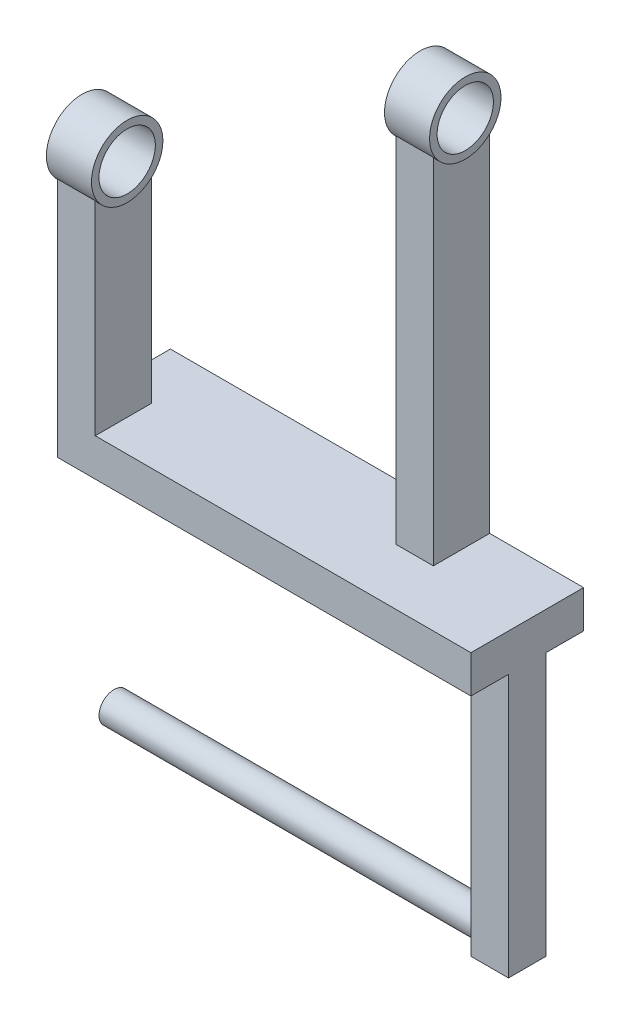
ISO-10303-21;
HEADER;
FILE_DESCRIPTION(('STEP AP214'),'2;1');
FILE_NAME('part.step','',(''),(''),'','','');
FILE_SCHEMA(('AUTOMOTIVE_DESIGN { 1 0 10303 214 1 1 1 1 }'));
ENDSEC;
DATA;
#1=APPLICATION_CONTEXT('core data for automotive mechanical design processes');
#2=APPLICATION_PROTOCOL_DEFINITION('international standard','automotive_design',2000,#1);
#3=PRODUCT_CONTEXT('',#1,'mechanical');
#4=PRODUCT('Part','Part','',(#3));
#5=PRODUCT_RELATED_PRODUCT_CATEGORY('part','',(#4));
#6=PRODUCT_DEFINITION_FORMATION('','',#4);
#7=PRODUCT_DEFINITION_CONTEXT('part definition',#1,'design');
#8=PRODUCT_DEFINITION('design','',#6,#7);
#9=PRODUCT_DEFINITION_SHAPE('','',#8);
#10=(LENGTH_UNIT() NAMED_UNIT(*) SI_UNIT(.MILLI.,.METRE.));
#11=(NAMED_UNIT(*) PLANE_ANGLE_UNIT() SI_UNIT($,.RADIAN.));
#12=(NAMED_UNIT(*) SI_UNIT($,.STERADIAN.) SOLID_ANGLE_UNIT());
#13=UNCERTAINTY_MEASURE_WITH_UNIT(LENGTH_MEASURE(1.E-05),#10,'distance_accuracy_value','');
#14=(GEOMETRIC_REPRESENTATION_CONTEXT(3) GLOBAL_UNCERTAINTY_ASSIGNED_CONTEXT((#13)) GLOBAL_UNIT_ASSIGNED_CONTEXT((#10,
#11,#12)) REPRESENTATION_CONTEXT('',''));
#15=CARTESIAN_POINT('',(0.,0.,0.));
#16=DIRECTION('',(0.,0.,1.));
#17=DIRECTION('',(1.,0.,0.));
#18=AXIS2_PLACEMENT_3D('',#15,#16,#17);
#19=CARTESIAN_POINT('',(-60.,10.,-15.));
#20=DIRECTION('',(0.,0.,1.));
#21=DIRECTION('',(1.,0.,0.));
#22=AXIS2_PLACEMENT_3D('',#19,#20,#21);
#23=PLANE('',#22);
#24=DIRECTION('',(1.,0.,0.));
#25=VECTOR('',#24,1.);
#26=CARTESIAN_POINT('',(14.,104.169048105155,-15.));
#27=LINE('',#26,#25);
#28=CARTESIAN_POINT('',(25.,104.169048105155,-15.));
#29=VERTEX_POINT('',#28);
#30=CARTESIAN_POINT('',(15.,104.169048105155,-15.));
#31=VERTEX_POINT('',#30);
#32=EDGE_CURVE('E218',#29,#31,#27,.F.);
#33=ORIENTED_EDGE('',*,*,#32,.F.);
#34=DIRECTION('',(0.,-1.,0.));
#35=VECTOR('',#34,1.);
#36=CARTESIAN_POINT('',(25.,110.,-15.));
#37=LINE('',#36,#35);
#38=CARTESIAN_POINT('',(25.,10.,-15.));
#39=VERTEX_POINT('',#38);
#40=EDGE_CURVE('E237',#29,#39,#37,.T.);
#41=ORIENTED_EDGE('',*,*,#40,.T.);
#42=DIRECTION('',(-1.,0.,0.));
#43=VECTOR('',#42,1.);
#44=CARTESIAN_POINT('',(-60.,10.,-15.));
#45=LINE('',#44,#43);
#46=CARTESIAN_POINT('',(50.,10.,-15.));
#47=VERTEX_POINT('',#46);
#48=EDGE_CURVE('E304',#47,#39,#45,.T.);
#49=ORIENTED_EDGE('',*,*,#48,.F.);
#50=DIRECTION('',(0.,-1.,0.));
#51=VECTOR('',#50,1.);
#52=CARTESIAN_POINT('',(50.,10.,-15.));
#53=LINE('',#52,#51);
#54=CARTESIAN_POINT('',(50.,0.,-15.));
#55=VERTEX_POINT('',#54);
#56=EDGE_CURVE('E322',#47,#55,#53,.T.);
#57=ORIENTED_EDGE('',*,*,#56,.T.);
#58=DIRECTION('',(-1.,0.,0.));
#59=VECTOR('',#58,1.);
#60=CARTESIAN_POINT('',(-60.,0.,-15.));
#61=LINE('',#60,#59);
#62=CARTESIAN_POINT('',(-60.,0.,-15.));
#63=VERTEX_POINT('',#62);
#64=EDGE_CURVE('E297',#55,#63,#61,.T.);
#65=ORIENTED_EDGE('',*,*,#64,.T.);
#66=DIRECTION('',(0.,-1.,0.));
#67=VECTOR('',#66,1.);
#68=CARTESIAN_POINT('',(-60.,10.,-15.));
#69=LINE('',#68,#67);
#70=CARTESIAN_POINT('',(-60.,10.,-15.));
#71=VERTEX_POINT('',#70);
#72=EDGE_CURVE('E308',#71,#63,#69,.T.);
#73=ORIENTED_EDGE('',*,*,#72,.F.);
#74=CARTESIAN_POINT('',(15.,10.,-15.));
#75=VERTEX_POINT('',#74);
#76=EDGE_CURVE('E303',#75,#71,#45,.T.);
#77=ORIENTED_EDGE('',*,*,#76,.F.);
#78=DIRECTION('',(0.,-1.,0.));
#79=VECTOR('',#78,1.);
#80=CARTESIAN_POINT('',(15.,110.,-15.));
#81=LINE('',#80,#79);
#82=EDGE_CURVE('E234',#31,#75,#81,.T.);
#83=ORIENTED_EDGE('',*,*,#82,.F.);
#84=EDGE_LOOP('',(#33,#41,#49,#57,#65,#73,#77,#83));
#85=FACE_BOUND('',#84,.T.);
#86=ADVANCED_FACE('F53',(#85),#23,.F.);
#87=CARTESIAN_POINT('',(15.,110.,0.));
#88=DIRECTION('',(0.,0.,-1.));
#89=DIRECTION('',(-1.,0.,0.));
#90=AXIS2_PLACEMENT_3D('',#87,#88,#89);
#91=PLANE('',#90);
#92=DIRECTION('',(1.,0.,0.));
#93=VECTOR('',#92,1.);
#94=CARTESIAN_POINT('',(14.,104.169048105155,0.));
#95=LINE('',#94,#93);
#96=CARTESIAN_POINT('',(15.,104.169048105155,0.));
#97=VERTEX_POINT('',#96);
#98=CARTESIAN_POINT('',(25.,104.169048105155,0.));
#99=VERTEX_POINT('',#98);
#100=EDGE_CURVE('E207',#97,#99,#95,.T.);
#101=ORIENTED_EDGE('',*,*,#100,.F.);
#102=DIRECTION('',(0.,-1.,0.));
#103=VECTOR('',#102,1.);
#104=CARTESIAN_POINT('',(15.,110.,0.));
#105=LINE('',#104,#103);
#106=CARTESIAN_POINT('',(15.,10.,0.));
#107=VERTEX_POINT('',#106);
#108=EDGE_CURVE('E243',#97,#107,#105,.T.);
#109=ORIENTED_EDGE('',*,*,#108,.T.);
#110=DIRECTION('',(1.,0.,0.));
#111=VECTOR('',#110,1.);
#112=CARTESIAN_POINT('',(15.,10.,0.));
#113=LINE('',#112,#111);
#114=CARTESIAN_POINT('',(25.,10.,0.));
#115=VERTEX_POINT('',#114);
#116=EDGE_CURVE('E226',#107,#115,#113,.T.);
#117=ORIENTED_EDGE('',*,*,#116,.T.);
#118=DIRECTION('',(0.,-1.,0.));
#119=VECTOR('',#118,1.);
#120=CARTESIAN_POINT('',(25.,110.,0.));
#121=LINE('',#120,#119);
#122=EDGE_CURVE('E240',#99,#115,#121,.T.);
#123=ORIENTED_EDGE('',*,*,#122,.F.);
#124=EDGE_LOOP('',(#101,#109,#117,#123));
#125=FACE_BOUND('',#124,.T.);
#126=ADVANCED_FACE('F345',(#125),#91,.F.);
#127=CARTESIAN_POINT('',(0.,10.,0.));
#128=DIRECTION('',(0.,-1.,0.));
#129=DIRECTION('',(0.,0.,-1.));
#130=AXIS2_PLACEMENT_3D('',#127,#128,#129);
#131=PLANE('',#130);
#132=DIRECTION('',(0.,0.,1.));
#133=VECTOR('',#132,1.);
#134=CARTESIAN_POINT('',(15.,10.,-15.));
#135=LINE('',#134,#133);
#136=EDGE_CURVE('E222',#75,#107,#135,.T.);
#137=ORIENTED_EDGE('',*,*,#136,.F.);
#138=ORIENTED_EDGE('',*,*,#76,.T.);
#139=DIRECTION('',(0.,0.,1.));
#140=VECTOR('',#139,1.);
#141=CARTESIAN_POINT('',(-60.,10.,15.));
#142=LINE('',#141,#140);
#143=CARTESIAN_POINT('',(-60.,10.,0.));
#144=VERTEX_POINT('',#143);
#145=EDGE_CURVE('E292',#71,#144,#142,.T.);
#146=ORIENTED_EDGE('',*,*,#145,.T.);
#147=DIRECTION('',(-1.,0.,0.));
#148=VECTOR('',#147,1.);
#149=CARTESIAN_POINT('',(-60.,10.,0.));
#150=LINE('',#149,#148);
#151=CARTESIAN_POINT('',(-50.,10.,0.));
#152=VERTEX_POINT('',#151);
#153=EDGE_CURVE('E278',#152,#144,#150,.T.);
#154=ORIENTED_EDGE('',*,*,#153,.F.);
#155=DIRECTION('',(0.,0.,-1.));
#156=VECTOR('',#155,1.);
#157=CARTESIAN_POINT('',(-50.,10.,15.));
#158=LINE('',#157,#156);
#159=CARTESIAN_POINT('',(-50.,10.,15.));
#160=VERTEX_POINT('',#159);
#161=EDGE_CURVE('E274',#160,#152,#158,.T.);
#162=ORIENTED_EDGE('',*,*,#161,.F.);
#163=DIRECTION('',(1.,0.,0.));
#164=VECTOR('',#163,1.);
#165=CARTESIAN_POINT('',(-60.,10.,15.));
#166=LINE('',#165,#164);
#167=CARTESIAN_POINT('',(50.,10.,15.));
#168=VERTEX_POINT('',#167);
#169=EDGE_CURVE('E296',#160,#168,#166,.T.);
#170=ORIENTED_EDGE('',*,*,#169,.T.);
#171=DIRECTION('',(0.,0.,-1.));
#172=VECTOR('',#171,1.);
#173=CARTESIAN_POINT('',(50.,10.,15.));
#174=LINE('',#173,#172);
#175=EDGE_CURVE('E300',#168,#47,#174,.T.);
#176=ORIENTED_EDGE('',*,*,#175,.T.);
#177=ORIENTED_EDGE('',*,*,#48,.T.);
#178=DIRECTION('',(0.,0.,-1.));
#179=VECTOR('',#178,1.);
#180=CARTESIAN_POINT('',(25.,10.,-15.));
#181=LINE('',#180,#179);
#182=EDGE_CURVE('E230',#115,#39,#181,.T.);
#183=ORIENTED_EDGE('',*,*,#182,.F.);
#184=ORIENTED_EDGE('',*,*,#116,.F.);
#185=EDGE_LOOP('',(#137,#138,#146,#154,#162,#170,#176,#177,#183,#184));
#186=FACE_BOUND('',#185,.T.);
#187=ADVANCED_FACE('F350',(#186),#131,.F.);
#188=CARTESIAN_POINT('',(-60.,10.,15.));
#189=DIRECTION('',(0.,0.,-1.));
#190=DIRECTION('',(-1.,0.,0.));
#191=AXIS2_PLACEMENT_3D('',#188,#189,#190);
#192=PLANE('',#191);
#193=DIRECTION('',(1.,0.,0.));
#194=VECTOR('',#193,1.);
#195=CARTESIAN_POINT('',(-61.,64.1690481051547,15.));
#196=LINE('',#195,#194);
#197=CARTESIAN_POINT('',(-60.,64.1690481051547,15.));
#198=VERTEX_POINT('',#197);
#199=CARTESIAN_POINT('',(-50.,64.1690481051547,15.));
#200=VERTEX_POINT('',#199);
#201=EDGE_CURVE('E266',#198,#200,#196,.T.);
#202=ORIENTED_EDGE('',*,*,#201,.F.);
#203=DIRECTION('',(0.,-1.,0.));
#204=VECTOR('',#203,1.);
#205=CARTESIAN_POINT('',(-60.,10.,15.));
#206=LINE('',#205,#204);
#207=CARTESIAN_POINT('',(-60.,0.,15.));
#208=VERTEX_POINT('',#207);
#209=EDGE_CURVE('E329',#198,#208,#206,.T.);
#210=ORIENTED_EDGE('',*,*,#209,.T.);
#211=DIRECTION('',(1.,0.,0.));
#212=VECTOR('',#211,1.);
#213=CARTESIAN_POINT('',(-60.,0.,15.));
#214=LINE('',#213,#212);
#215=CARTESIAN_POINT('',(50.,0.,15.));
#216=VERTEX_POINT('',#215);
#217=EDGE_CURVE('E312',#208,#216,#214,.T.);
#218=ORIENTED_EDGE('',*,*,#217,.T.);
#219=DIRECTION('',(0.,-1.,0.));
#220=VECTOR('',#219,1.);
#221=CARTESIAN_POINT('',(50.,10.,15.));
#222=LINE('',#221,#220);
#223=EDGE_CURVE('E326',#168,#216,#222,.T.);
#224=ORIENTED_EDGE('',*,*,#223,.F.);
#225=ORIENTED_EDGE('',*,*,#169,.F.);
#226=DIRECTION('',(0.,-1.,0.));
#227=VECTOR('',#226,1.);
#228=CARTESIAN_POINT('',(-50.,70.,15.));
#229=LINE('',#228,#227);
#230=EDGE_CURVE('E288',#200,#160,#229,.T.);
#231=ORIENTED_EDGE('',*,*,#230,.F.);
#232=EDGE_LOOP('',(#202,#210,#218,#224,#225,#231));
#233=FACE_BOUND('',#232,.T.);
#234=ADVANCED_FACE('F381',(#233),#192,.F.);
#235=CARTESIAN_POINT('',(-60.,70.,0.));
#236=DIRECTION('',(0.,0.,1.));
#237=DIRECTION('',(1.,0.,0.));
#238=AXIS2_PLACEMENT_3D('',#235,#236,#237);
#239=PLANE('',#238);
#240=DIRECTION('',(1.,0.,0.));
#241=VECTOR('',#240,1.);
#242=CARTESIAN_POINT('',(-61.,64.1690481051547,0.));
#243=LINE('',#242,#241);
#244=CARTESIAN_POINT('',(-50.,64.1690481051547,0.));
#245=VERTEX_POINT('',#244);
#246=CARTESIAN_POINT('',(-60.,64.1690481051547,0.));
#247=VERTEX_POINT('',#246);
#248=EDGE_CURVE('E332',#245,#247,#243,.F.);
#249=ORIENTED_EDGE('',*,*,#248,.F.);
#250=DIRECTION('',(0.,-1.,0.));
#251=VECTOR('',#250,1.);
#252=CARTESIAN_POINT('',(-50.,70.,0.));
#253=LINE('',#252,#251);
#254=EDGE_CURVE('E285',#245,#152,#253,.T.);
#255=ORIENTED_EDGE('',*,*,#254,.T.);
#256=ORIENTED_EDGE('',*,*,#153,.T.);
#257=DIRECTION('',(0.,-1.,0.));
#258=VECTOR('',#257,1.);
#259=CARTESIAN_POINT('',(-60.,70.,0.));
#260=LINE('',#259,#258);
#261=EDGE_CURVE('E282',#247,#144,#260,.T.);
#262=ORIENTED_EDGE('',*,*,#261,.F.);
#263=EDGE_LOOP('',(#249,#255,#256,#262));
#264=FACE_BOUND('',#263,.T.);
#265=ADVANCED_FACE('F373',(#264),#239,.F.);
#266=CARTESIAN_POINT('',(-60.,10.,15.));
#267=DIRECTION('',(1.,0.,0.));
#268=DIRECTION('',(0.,0.,-1.));
#269=AXIS2_PLACEMENT_3D('',#266,#267,#268);
#270=PLANE('',#269);
#271=CARTESIAN_POINT('',(-60.,70.,7.5));
#272=DIRECTION('',(1.,0.,0.));
#273=DIRECTION('',(0.,0.,-1.));
#274=AXIS2_PLACEMENT_3D('',#271,#272,#273);
#275=CIRCLE('',#274,9.5);
#276=EDGE_CURVE('E270',#247,#198,#275,.F.);
#277=ORIENTED_EDGE('',*,*,#276,.F.);
#278=ORIENTED_EDGE('',*,*,#261,.T.);
#279=ORIENTED_EDGE('',*,*,#145,.F.);
#280=ORIENTED_EDGE('',*,*,#72,.T.);
#281=DIRECTION('',(0.,0.,1.));
#282=VECTOR('',#281,1.);
#283=CARTESIAN_POINT('',(-60.,0.,15.));
#284=LINE('',#283,#282);
#285=EDGE_CURVE('E291',#63,#208,#284,.T.);
#286=ORIENTED_EDGE('',*,*,#285,.T.);
#287=ORIENTED_EDGE('',*,*,#209,.F.);
#288=EDGE_LOOP('',(#277,#278,#279,#280,#286,#287));
#289=FACE_BOUND('',#288,.T.);
#290=ADVANCED_FACE('F55',(#289),#270,.F.);
#291=CARTESIAN_POINT('',(50.,10.,15.));
#292=DIRECTION('',(-1.,0.,0.));
#293=DIRECTION('',(0.,0.,1.));
#294=AXIS2_PLACEMENT_3D('',#291,#292,#293);
#295=PLANE('',#294);
#296=DIRECTION('',(0.,0.,-1.));
#297=VECTOR('',#296,1.);
#298=CARTESIAN_POINT('',(50.,0.,15.));
#299=LINE('',#298,#297);
#300=CARTESIAN_POINT('',(50.,0.,5.));
#301=VERTEX_POINT('',#300);
#302=EDGE_CURVE('E186',#216,#301,#299,.T.);
#303=ORIENTED_EDGE('',*,*,#302,.T.);
#304=DIRECTION('',(0.,1.,0.));
#305=VECTOR('',#304,1.);
#306=CARTESIAN_POINT('',(50.,-70.,5.));
#307=LINE('',#306,#305);
#308=CARTESIAN_POINT('',(50.,-70.,5.));
#309=VERTEX_POINT('',#308);
#310=EDGE_CURVE('E164',#309,#301,#307,.T.);
#311=ORIENTED_EDGE('',*,*,#310,.F.);
#312=DIRECTION('',(0.,0.,1.));
#313=VECTOR('',#312,1.);
#314=CARTESIAN_POINT('',(50.,-70.,-5.));
#315=LINE('',#314,#313);
#316=CARTESIAN_POINT('',(50.,-70.,-5.));
#317=VERTEX_POINT('',#316);
#318=EDGE_CURVE('E171',#317,#309,#315,.T.);
#319=ORIENTED_EDGE('',*,*,#318,.F.);
#320=DIRECTION('',(0.,1.,0.));
#321=VECTOR('',#320,1.);
#322=CARTESIAN_POINT('',(50.,-70.,-5.));
#323=LINE('',#322,#321);
#324=CARTESIAN_POINT('',(50.,0.,-5.));
#325=VERTEX_POINT('',#324);
#326=EDGE_CURVE('E363',#317,#325,#323,.T.);
#327=ORIENTED_EDGE('',*,*,#326,.T.);
#328=EDGE_CURVE('E74',#325,#55,#299,.T.);
#329=ORIENTED_EDGE('',*,*,#328,.T.);
#330=ORIENTED_EDGE('',*,*,#56,.F.);
#331=ORIENTED_EDGE('',*,*,#175,.F.);
#332=ORIENTED_EDGE('',*,*,#223,.T.);
#333=EDGE_LOOP('',(#303,#311,#319,#327,#329,#330,#331,#332));
#334=FACE_BOUND('',#333,.T.);
#335=ADVANCED_FACE('F183',(#334),#295,.F.);
#336=CARTESIAN_POINT('',(0.,0.,0.));
#337=DIRECTION('',(0.,-1.,0.));
#338=DIRECTION('',(0.,0.,-1.));
#339=AXIS2_PLACEMENT_3D('',#336,#337,#338);
#340=PLANE('',#339);
#341=DIRECTION('',(1.,0.,0.));
#342=VECTOR('',#341,1.);
#343=CARTESIAN_POINT('',(50.,0.,-5.));
#344=LINE('',#343,#342);
#345=CARTESIAN_POINT('',(40.,0.,-5.));
#346=VERTEX_POINT('',#345);
#347=EDGE_CURVE('E69',#346,#325,#344,.T.);
#348=ORIENTED_EDGE('',*,*,#347,.F.);
#349=DIRECTION('',(0.,0.,-1.));
#350=VECTOR('',#349,1.);
#351=CARTESIAN_POINT('',(40.,0.,-5.));
#352=LINE('',#351,#350);
#353=CARTESIAN_POINT('',(40.,0.,5.));
#354=VERTEX_POINT('',#353);
#355=EDGE_CURVE('E385',#354,#346,#352,.T.);
#356=ORIENTED_EDGE('',*,*,#355,.F.);
#357=DIRECTION('',(-1.,0.,0.));
#358=VECTOR('',#357,1.);
#359=CARTESIAN_POINT('',(50.,0.,5.));
#360=LINE('',#359,#358);
#361=EDGE_CURVE('E384',#301,#354,#360,.T.);
#362=ORIENTED_EDGE('',*,*,#361,.F.);
#363=ORIENTED_EDGE('',*,*,#302,.F.);
#364=ORIENTED_EDGE('',*,*,#217,.F.);
#365=ORIENTED_EDGE('',*,*,#285,.F.);
#366=ORIENTED_EDGE('',*,*,#64,.F.);
#367=ORIENTED_EDGE('',*,*,#328,.F.);
#368=EDGE_LOOP('',(#348,#356,#362,#363,#364,#365,#366,#367));
#369=FACE_BOUND('',#368,.T.);
#370=ADVANCED_FACE('F365',(#369),#340,.T.);
#371=CARTESIAN_POINT('',(-50.,70.,15.));
#372=DIRECTION('',(-1.,0.,0.));
#373=DIRECTION('',(0.,0.,1.));
#374=AXIS2_PLACEMENT_3D('',#371,#372,#373);
#375=PLANE('',#374);
#376=CARTESIAN_POINT('',(-50.,70.,7.5));
#377=DIRECTION('',(-1.,0.,0.));
#378=DIRECTION('',(0.,0.,1.));
#379=AXIS2_PLACEMENT_3D('',#376,#377,#378);
#380=CIRCLE('',#379,9.5);
#381=EDGE_CURVE('E259',#200,#245,#380,.F.);
#382=ORIENTED_EDGE('',*,*,#381,.F.);
#383=ORIENTED_EDGE('',*,*,#230,.T.);
#384=ORIENTED_EDGE('',*,*,#161,.T.);
#385=ORIENTED_EDGE('',*,*,#254,.F.);
#386=EDGE_LOOP('',(#382,#383,#384,#385));
#387=FACE_BOUND('',#386,.T.);
#388=ADVANCED_FACE('F376',(#387),#375,.F.);
#389=CARTESIAN_POINT('',(-61.,70.,7.5));
#390=DIRECTION('',(1.,0.,0.));
#391=DIRECTION('',(0.,0.,-1.));
#392=AXIS2_PLACEMENT_3D('',#389,#390,#391);
#393=CYLINDRICAL_SURFACE('',#392,9.5);
#394=CARTESIAN_POINT('',(-61.,70.,7.5));
#395=DIRECTION('',(-1.,0.,0.));
#396=DIRECTION('',(0.,0.,1.));
#397=AXIS2_PLACEMENT_3D('',#394,#395,#396);
#398=CIRCLE('',#397,9.5);
#399=CARTESIAN_POINT('',(-61.,70.,17.));
#400=VERTEX_POINT('',#399);
#401=EDGE_CURVE('E255',#400,#400,#398,.T.);
#402=ORIENTED_EDGE('',*,*,#401,.F.);
#403=EDGE_LOOP('',(#402));
#404=FACE_BOUND('',#403,.T.);
#405=CARTESIAN_POINT('',(-49.,70.,7.5));
#406=DIRECTION('',(-1.,0.,0.));
#407=DIRECTION('',(0.,0.,1.));
#408=AXIS2_PLACEMENT_3D('',#405,#406,#407);
#409=CIRCLE('',#408,9.5);
#410=CARTESIAN_POINT('',(-49.,70.,17.));
#411=VERTEX_POINT('',#410);
#412=EDGE_CURVE('E251',#411,#411,#409,.T.);
#413=ORIENTED_EDGE('',*,*,#412,.T.);
#414=EDGE_LOOP('',(#413));
#415=FACE_BOUND('',#414,.T.);
#416=ORIENTED_EDGE('',*,*,#248,.T.);
#417=ORIENTED_EDGE('',*,*,#276,.T.);
#418=ORIENTED_EDGE('',*,*,#201,.T.);
#419=ORIENTED_EDGE('',*,*,#381,.T.);
#420=EDGE_LOOP('',(#416,#417,#418,#419));
#421=FACE_BOUND('',#420,.T.);
#422=ADVANCED_FACE('F379',(#404,#415,#421),#393,.T.);
#423=CARTESIAN_POINT('',(-61.,70.,7.5));
#424=DIRECTION('',(1.,0.,0.));
#425=DIRECTION('',(0.,0.,-1.));
#426=AXIS2_PLACEMENT_3D('',#423,#424,#425);
#427=CYLINDRICAL_SURFACE('',#426,7.5);
#428=CARTESIAN_POINT('',(-49.,70.,7.5));
#429=DIRECTION('',(-1.,0.,0.));
#430=DIRECTION('',(0.,0.,1.));
#431=AXIS2_PLACEMENT_3D('',#428,#429,#430);
#432=CIRCLE('',#431,7.5);
#433=CARTESIAN_POINT('',(-49.,70.,15.));
#434=VERTEX_POINT('',#433);
#435=EDGE_CURVE('E246',#434,#434,#432,.T.);
#436=ORIENTED_EDGE('',*,*,#435,.F.);
#437=EDGE_LOOP('',(#436));
#438=FACE_BOUND('',#437,.T.);
#439=CARTESIAN_POINT('',(-61.,70.,7.5));
#440=DIRECTION('',(-1.,0.,0.));
#441=DIRECTION('',(0.,0.,1.));
#442=AXIS2_PLACEMENT_3D('',#439,#440,#441);
#443=CIRCLE('',#442,7.5);
#444=CARTESIAN_POINT('',(-61.,70.,15.));
#445=VERTEX_POINT('',#444);
#446=EDGE_CURVE('E247',#445,#445,#443,.T.);
#447=ORIENTED_EDGE('',*,*,#446,.T.);
#448=EDGE_LOOP('',(#447));
#449=FACE_BOUND('',#448,.T.);
#450=ADVANCED_FACE('F443',(#438,#449),#427,.F.);
#451=CARTESIAN_POINT('',(-61.,70.,7.5));
#452=DIRECTION('',(-1.,0.,0.));
#453=DIRECTION('',(0.,0.,1.));
#454=AXIS2_PLACEMENT_3D('',#451,#452,#453);
#455=PLANE('',#454);
#456=ORIENTED_EDGE('',*,*,#401,.T.);
#457=EDGE_LOOP('',(#456));
#458=FACE_BOUND('',#457,.T.);
#459=ORIENTED_EDGE('',*,*,#446,.F.);
#460=EDGE_LOOP('',(#459));
#461=FACE_BOUND('',#460,.T.);
#462=ADVANCED_FACE('F448',(#458,#461),#455,.T.);
#463=CARTESIAN_POINT('',(-49.,70.,7.5));
#464=DIRECTION('',(-1.,0.,0.));
#465=DIRECTION('',(0.,0.,1.));
#466=AXIS2_PLACEMENT_3D('',#463,#464,#465);
#467=PLANE('',#466);
#468=ORIENTED_EDGE('',*,*,#412,.F.);
#469=EDGE_LOOP('',(#468));
#470=FACE_BOUND('',#469,.T.);
#471=ORIENTED_EDGE('',*,*,#435,.T.);
#472=EDGE_LOOP('',(#471));
#473=FACE_BOUND('',#472,.T.);
#474=ADVANCED_FACE('F445',(#470,#473),#467,.F.);
#475=CARTESIAN_POINT('',(15.,110.,-15.));
#476=DIRECTION('',(1.,0.,0.));
#477=DIRECTION('',(0.,0.,-1.));
#478=AXIS2_PLACEMENT_3D('',#475,#476,#477);
#479=PLANE('',#478);
#480=CARTESIAN_POINT('',(15.,110.,-7.5));
#481=DIRECTION('',(1.,0.,0.));
#482=DIRECTION('',(0.,0.,-1.));
#483=AXIS2_PLACEMENT_3D('',#480,#481,#482);
#484=CIRCLE('',#483,9.5);
#485=EDGE_CURVE('E214',#31,#97,#484,.F.);
#486=ORIENTED_EDGE('',*,*,#485,.F.);
#487=ORIENTED_EDGE('',*,*,#82,.T.);
#488=ORIENTED_EDGE('',*,*,#136,.T.);
#489=ORIENTED_EDGE('',*,*,#108,.F.);
#490=EDGE_LOOP('',(#486,#487,#488,#489));
#491=FACE_BOUND('',#490,.T.);
#492=ADVANCED_FACE('F352',(#491),#479,.F.);
#493=CARTESIAN_POINT('',(25.,110.,-15.));
#494=DIRECTION('',(-1.,0.,0.));
#495=DIRECTION('',(0.,0.,1.));
#496=AXIS2_PLACEMENT_3D('',#493,#494,#495);
#497=PLANE('',#496);
#498=CARTESIAN_POINT('',(25.,110.,-7.5));
#499=DIRECTION('',(-1.,0.,0.));
#500=DIRECTION('',(0.,0.,1.));
#501=AXIS2_PLACEMENT_3D('',#498,#499,#500);
#502=CIRCLE('',#501,9.5);
#503=EDGE_CURVE('E62',#99,#29,#502,.F.);
#504=ORIENTED_EDGE('',*,*,#503,.F.);
#505=ORIENTED_EDGE('',*,*,#122,.T.);
#506=ORIENTED_EDGE('',*,*,#182,.T.);
#507=ORIENTED_EDGE('',*,*,#40,.F.);
#508=EDGE_LOOP('',(#504,#505,#506,#507));
#509=FACE_BOUND('',#508,.T.);
#510=ADVANCED_FACE('F342',(#509),#497,.F.);
#511=CARTESIAN_POINT('',(14.,110.,-7.5));
#512=DIRECTION('',(1.,0.,0.));
#513=DIRECTION('',(0.,0.,-1.));
#514=AXIS2_PLACEMENT_3D('',#511,#512,#513);
#515=CYLINDRICAL_SURFACE('',#514,9.5);
#516=CARTESIAN_POINT('',(14.,110.,-7.5));
#517=DIRECTION('',(-1.,0.,0.));
#518=DIRECTION('',(0.,0.,1.));
#519=AXIS2_PLACEMENT_3D('',#516,#517,#518);
#520=CIRCLE('',#519,9.5);
#521=CARTESIAN_POINT('',(14.,110.,2.));
#522=VERTEX_POINT('',#521);
#523=EDGE_CURVE('E203',#522,#522,#520,.T.);
#524=ORIENTED_EDGE('',*,*,#523,.F.);
#525=EDGE_LOOP('',(#524));
#526=FACE_BOUND('',#525,.T.);
#527=CARTESIAN_POINT('',(26.,110.,-7.5));
#528=DIRECTION('',(-1.,0.,0.));
#529=DIRECTION('',(0.,0.,1.));
#530=AXIS2_PLACEMENT_3D('',#527,#528,#529);
#531=CIRCLE('',#530,9.5);
#532=CARTESIAN_POINT('',(26.,110.,2.));
#533=VERTEX_POINT('',#532);
#534=EDGE_CURVE('E201',#533,#533,#531,.T.);
#535=ORIENTED_EDGE('',*,*,#534,.T.);
#536=EDGE_LOOP('',(#535));
#537=FACE_BOUND('',#536,.T.);
#538=ORIENTED_EDGE('',*,*,#503,.T.);
#539=ORIENTED_EDGE('',*,*,#32,.T.);
#540=ORIENTED_EDGE('',*,*,#485,.T.);
#541=ORIENTED_EDGE('',*,*,#100,.T.);
#542=EDGE_LOOP('',(#538,#539,#540,#541));
#543=FACE_BOUND('',#542,.T.);
#544=ADVANCED_FACE('F338',(#526,#537,#543),#515,.T.);
#545=CARTESIAN_POINT('',(14.,110.,-7.5));
#546=DIRECTION('',(1.,0.,0.));
#547=DIRECTION('',(0.,0.,-1.));
#548=AXIS2_PLACEMENT_3D('',#545,#546,#547);
#549=CYLINDRICAL_SURFACE('',#548,7.5);
#550=CARTESIAN_POINT('',(26.,110.,-7.5));
#551=DIRECTION('',(-1.,0.,0.));
#552=DIRECTION('',(0.,0.,1.));
#553=AXIS2_PLACEMENT_3D('',#550,#551,#552);
#554=CIRCLE('',#553,7.5);
#555=CARTESIAN_POINT('',(26.,110.,0.));
#556=VERTEX_POINT('',#555);
#557=EDGE_CURVE('E188',#556,#556,#554,.T.);
#558=ORIENTED_EDGE('',*,*,#557,.F.);
#559=EDGE_LOOP('',(#558));
#560=FACE_BOUND('',#559,.T.);
#561=CARTESIAN_POINT('',(14.,110.,-7.5));
#562=DIRECTION('',(-1.,0.,0.));
#563=DIRECTION('',(0.,0.,1.));
#564=AXIS2_PLACEMENT_3D('',#561,#562,#563);
#565=CIRCLE('',#564,7.5);
#566=CARTESIAN_POINT('',(14.,110.,0.));
#567=VERTEX_POINT('',#566);
#568=EDGE_CURVE('E193',#567,#567,#565,.T.);
#569=ORIENTED_EDGE('',*,*,#568,.T.);
#570=EDGE_LOOP('',(#569));
#571=FACE_BOUND('',#570,.T.);
#572=ADVANCED_FACE('F462',(#560,#571),#549,.F.);
#573=CARTESIAN_POINT('',(14.,110.,-7.5));
#574=DIRECTION('',(-1.,0.,0.));
#575=DIRECTION('',(0.,0.,1.));
#576=AXIS2_PLACEMENT_3D('',#573,#574,#575);
#577=PLANE('',#576);
#578=ORIENTED_EDGE('',*,*,#523,.T.);
#579=EDGE_LOOP('',(#578));
#580=FACE_BOUND('',#579,.T.);
#581=ORIENTED_EDGE('',*,*,#568,.F.);
#582=EDGE_LOOP('',(#581));
#583=FACE_BOUND('',#582,.T.);
#584=ADVANCED_FACE('F466',(#580,#583),#577,.T.);
#585=CARTESIAN_POINT('',(26.,110.,-7.5));
#586=DIRECTION('',(-1.,0.,0.));
#587=DIRECTION('',(0.,0.,1.));
#588=AXIS2_PLACEMENT_3D('',#585,#586,#587);
#589=PLANE('',#588);
#590=ORIENTED_EDGE('',*,*,#534,.F.);
#591=EDGE_LOOP('',(#590));
#592=FACE_BOUND('',#591,.T.);
#593=ORIENTED_EDGE('',*,*,#557,.T.);
#594=EDGE_LOOP('',(#593));
#595=FACE_BOUND('',#594,.T.);
#596=ADVANCED_FACE('F417',(#592,#595),#589,.F.);
#597=CARTESIAN_POINT('',(50.,-70.,5.));
#598=DIRECTION('',(0.,0.,-1.));
#599=DIRECTION('',(-1.,0.,0.));
#600=AXIS2_PLACEMENT_3D('',#597,#598,#599);
#601=PLANE('',#600);
#602=ORIENTED_EDGE('',*,*,#361,.T.);
#603=DIRECTION('',(0.,1.,0.));
#604=VECTOR('',#603,1.);
#605=CARTESIAN_POINT('',(40.,-70.,5.));
#606=LINE('',#605,#604);
#607=CARTESIAN_POINT('',(40.,-70.,5.));
#608=VERTEX_POINT('',#607);
#609=EDGE_CURVE('E166',#608,#354,#606,.T.);
#610=ORIENTED_EDGE('',*,*,#609,.F.);
#611=DIRECTION('',(-1.,0.,0.));
#612=VECTOR('',#611,1.);
#613=CARTESIAN_POINT('',(50.,-70.,5.));
#614=LINE('',#613,#612);
#615=EDGE_CURVE('E159',#309,#608,#614,.T.);
#616=ORIENTED_EDGE('',*,*,#615,.F.);
#617=ORIENTED_EDGE('',*,*,#310,.T.);
#618=EDGE_LOOP('',(#602,#610,#616,#617));
#619=FACE_BOUND('',#618,.T.);
#620=ADVANCED_FACE('F162',(#619),#601,.F.);
#621=CARTESIAN_POINT('',(40.,-70.,-5.));
#622=DIRECTION('',(1.,0.,0.));
#623=DIRECTION('',(0.,0.,-1.));
#624=AXIS2_PLACEMENT_3D('',#621,#622,#623);
#625=PLANE('',#624);
#626=CARTESIAN_POINT('',(40.,-65.,0.));
#627=DIRECTION('',(1.,0.,0.));
#628=DIRECTION('',(0.,0.,-1.));
#629=AXIS2_PLACEMENT_3D('',#626,#627,#628);
#630=CIRCLE('',#629,4.);
#631=CARTESIAN_POINT('',(40.,-65.,-4.));
#632=VERTEX_POINT('',#631);
#633=EDGE_CURVE('E12',#632,#632,#630,.F.);
#634=ORIENTED_EDGE('',*,*,#633,.F.);
#635=EDGE_LOOP('',(#634));
#636=FACE_BOUND('',#635,.T.);
#637=ORIENTED_EDGE('',*,*,#355,.T.);
#638=DIRECTION('',(0.,1.,0.));
#639=VECTOR('',#638,1.);
#640=CARTESIAN_POINT('',(40.,-70.,-5.));
#641=LINE('',#640,#639);
#642=CARTESIAN_POINT('',(40.,-70.,-5.));
#643=VERTEX_POINT('',#642);
#644=EDGE_CURVE('E195',#643,#346,#641,.T.);
#645=ORIENTED_EDGE('',*,*,#644,.F.);
#646=DIRECTION('',(0.,0.,-1.));
#647=VECTOR('',#646,1.);
#648=CARTESIAN_POINT('',(40.,-70.,-5.));
#649=LINE('',#648,#647);
#650=EDGE_CURVE('E170',#608,#643,#649,.T.);
#651=ORIENTED_EDGE('',*,*,#650,.F.);
#652=ORIENTED_EDGE('',*,*,#609,.T.);
#653=EDGE_LOOP('',(#637,#645,#651,#652));
#654=FACE_BOUND('',#653,.T.);
#655=ADVANCED_FACE('F406',(#636,#654),#625,.F.);
#656=CARTESIAN_POINT('',(50.,-70.,-5.));
#657=DIRECTION('',(0.,0.,1.));
#658=DIRECTION('',(1.,0.,0.));
#659=AXIS2_PLACEMENT_3D('',#656,#657,#658);
#660=PLANE('',#659);
#661=ORIENTED_EDGE('',*,*,#347,.T.);
#662=ORIENTED_EDGE('',*,*,#326,.F.);
#663=DIRECTION('',(1.,0.,0.));
#664=VECTOR('',#663,1.);
#665=CARTESIAN_POINT('',(50.,-70.,-5.));
#666=LINE('',#665,#664);
#667=EDGE_CURVE('E176',#643,#317,#666,.T.);
#668=ORIENTED_EDGE('',*,*,#667,.F.);
#669=ORIENTED_EDGE('',*,*,#644,.T.);
#670=EDGE_LOOP('',(#661,#662,#668,#669));
#671=FACE_BOUND('',#670,.T.);
#672=ADVANCED_FACE('F404',(#671),#660,.F.);
#673=CARTESIAN_POINT('',(0.,-70.,0.));
#674=DIRECTION('',(0.,-1.,0.));
#675=DIRECTION('',(0.,0.,-1.));
#676=AXIS2_PLACEMENT_3D('',#673,#674,#675);
#677=PLANE('',#676);
#678=ORIENTED_EDGE('',*,*,#318,.T.);
#679=ORIENTED_EDGE('',*,*,#615,.T.);
#680=ORIENTED_EDGE('',*,*,#650,.T.);
#681=ORIENTED_EDGE('',*,*,#667,.T.);
#682=EDGE_LOOP('',(#678,#679,#680,#681));
#683=FACE_BOUND('',#682,.T.);
#684=ADVANCED_FACE('F174',(#683),#677,.T.);
#685=CARTESIAN_POINT('',(-60.,-65.,0.));
#686=DIRECTION('',(1.,0.,0.));
#687=DIRECTION('',(0.,0.,-1.));
#688=AXIS2_PLACEMENT_3D('',#685,#686,#687);
#689=CYLINDRICAL_SURFACE('',#688,4.);
#690=CARTESIAN_POINT('',(-60.,-65.,0.));
#691=DIRECTION('',(-1.,0.,0.));
#692=DIRECTION('',(0.,0.,1.));
#693=AXIS2_PLACEMENT_3D('',#690,#691,#692);
#694=CIRCLE('',#693,4.);
#695=CARTESIAN_POINT('',(-60.,-65.,4.));
#696=VERTEX_POINT('',#695);
#697=EDGE_CURVE('E387',#696,#696,#694,.T.);
#698=ORIENTED_EDGE('',*,*,#697,.F.);
#699=EDGE_LOOP('',(#698));
#700=FACE_BOUND('',#699,.T.);
#701=ORIENTED_EDGE('',*,*,#633,.T.);
#702=EDGE_LOOP('',(#701));
#703=FACE_BOUND('',#702,.T.);
#704=ADVANCED_FACE('F515',(#700,#703),#689,.T.);
#705=CARTESIAN_POINT('',(-60.,-65.,0.));
#706=DIRECTION('',(-1.,0.,0.));
#707=DIRECTION('',(0.,0.,1.));
#708=AXIS2_PLACEMENT_3D('',#705,#706,#707);
#709=PLANE('',#708);
#710=ORIENTED_EDGE('',*,*,#697,.T.);
#711=EDGE_LOOP('',(#710));
#712=FACE_BOUND('',#711,.T.);
#713=ADVANCED_FACE('F528',(#712),#709,.T.);
#714=CLOSED_SHELL('',(#86,#126,#187,#234,#265,#290,#335,#370,#388,#422,#450,#462,#474,#492,#510,
#544,#572,#584,#596,#620,#655,#672,#684,#704,#713));
#715=MANIFOLD_SOLID_BREP('B2',#714);
#716=ADVANCED_BREP_SHAPE_REPRESENTATION('',(#18,#715),#14);
#717=SHAPE_DEFINITION_REPRESENTATION(#9,#716);
ENDSEC;
END-ISO-10303-21;
